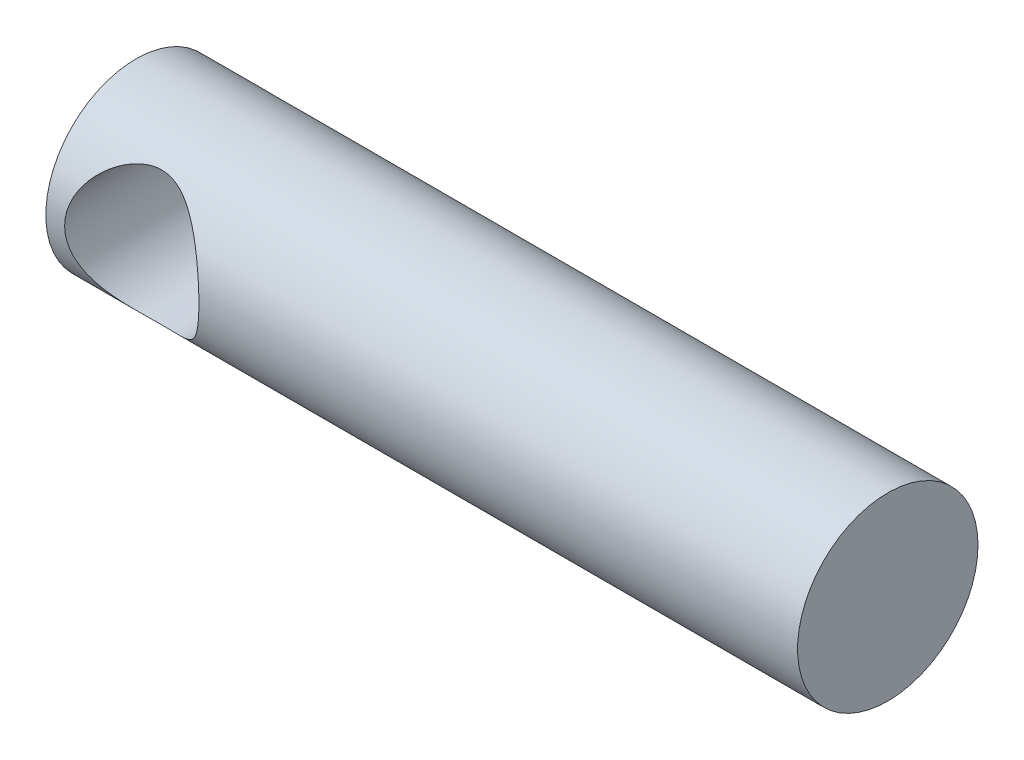
ISO-10303-21;
HEADER;
FILE_DESCRIPTION(('STEP AP214'),'2;1');
FILE_NAME('part.step','',(''),(''),'','','');
FILE_SCHEMA(('AUTOMOTIVE_DESIGN { 1 0 10303 214 1 1 1 1 }'));
ENDSEC;
DATA;
#1=APPLICATION_CONTEXT('core data for automotive mechanical design processes');
#2=APPLICATION_PROTOCOL_DEFINITION('international standard','automotive_design',2000,#1);
#3=PRODUCT_CONTEXT('',#1,'mechanical');
#4=PRODUCT('Part','Part','',(#3));
#5=PRODUCT_RELATED_PRODUCT_CATEGORY('part','',(#4));
#6=PRODUCT_DEFINITION_FORMATION('','',#4);
#7=PRODUCT_DEFINITION_CONTEXT('part definition',#1,'design');
#8=PRODUCT_DEFINITION('design','',#6,#7);
#9=PRODUCT_DEFINITION_SHAPE('','',#8);
#10=(LENGTH_UNIT() NAMED_UNIT(*) SI_UNIT(.MILLI.,.METRE.));
#11=(NAMED_UNIT(*) PLANE_ANGLE_UNIT() SI_UNIT($,.RADIAN.));
#12=(NAMED_UNIT(*) SI_UNIT($,.STERADIAN.) SOLID_ANGLE_UNIT());
#13=UNCERTAINTY_MEASURE_WITH_UNIT(LENGTH_MEASURE(1.E-05),#10,'distance_accuracy_value','');
#14=(GEOMETRIC_REPRESENTATION_CONTEXT(3) GLOBAL_UNCERTAINTY_ASSIGNED_CONTEXT((#13)) GLOBAL_UNIT_ASSIGNED_CONTEXT((#10,
#11,#12)) REPRESENTATION_CONTEXT('',''));
#15=CARTESIAN_POINT('',(0.,0.,0.));
#16=DIRECTION('',(0.,0.,1.));
#17=DIRECTION('',(1.,0.,0.));
#18=AXIS2_PLACEMENT_3D('',#15,#16,#17);
#19=CARTESIAN_POINT('',(88.9,0.,0.));
#20=DIRECTION('',(-1.,0.,0.));
#21=DIRECTION('',(0.,0.,1.));
#22=AXIS2_PLACEMENT_3D('',#19,#20,#21);
#23=CYLINDRICAL_SURFACE('',#22,10.668);
#24=CARTESIAN_POINT('',(18.0975,0.,-10.668));
#25=CARTESIAN_POINT('',(18.0974981537313,0.194173463493706,-10.6679982235985));
#26=CARTESIAN_POINT('',(18.0903612127066,0.388414681727751,-10.6626851014942));
#27=CARTESIAN_POINT('',(18.0619231269026,0.775371224910893,-10.6415515291348));
#28=CARTESIAN_POINT('',(18.0406124500999,0.968085434609475,-10.6257240078167));
#29=CARTESIAN_POINT('',(17.9841165819951,1.35077445291409,-10.5838913816648));
#30=CARTESIAN_POINT('',(17.9489017705879,1.54074250986207,-10.5578645500405));
#31=CARTESIAN_POINT('',(17.8651348478739,1.91620039976705,-10.4962191805586));
#32=CARTESIAN_POINT('',(17.8165767442088,2.10168817985684,-10.4605963333546));
#33=CARTESIAN_POINT('',(17.707191402614,2.46570283470104,-10.3808008556625));
#34=CARTESIAN_POINT('',(17.6464477470115,2.64426774285717,-10.336686548424));
#35=CARTESIAN_POINT('',(17.5132268276069,2.99485306886229,-10.240611925396));
#36=CARTESIAN_POINT('',(17.4407449239797,3.16687086546523,-10.1886485076052));
#37=CARTESIAN_POINT('',(17.2849151711086,3.50340515922758,-10.0778833564138));
#38=CARTESIAN_POINT('',(17.2015770932707,3.66792822462135,-10.01908777757));
#39=CARTESIAN_POINT('',(17.024707942592,3.98915095153025,-9.89558104965941));
#40=CARTESIAN_POINT('',(16.9311730791748,4.14584767188158,-9.83086770215852));
#41=CARTESIAN_POINT('',(16.7255890251142,4.46499899079594,-9.69036305318783));
#42=CARTESIAN_POINT('',(16.6126282743574,4.6266584229006,-9.61410026399102));
#43=CARTESIAN_POINT('',(16.3761940459171,4.93977069249647,-9.45703840106685));
#44=CARTESIAN_POINT('',(16.2527192207456,5.09122221726879,-9.37623874634635));
#45=CARTESIAN_POINT('',(15.9957185485215,5.383891027631,-9.21130812165831));
#46=CARTESIAN_POINT('',(15.8621771398846,5.52509177700157,-9.12717209335581));
#47=CARTESIAN_POINT('',(15.5857728367293,5.79676117729454,-8.95709017199413));
#48=CARTESIAN_POINT('',(15.4429125206291,5.92723277443433,-8.8711447839807));
#49=CARTESIAN_POINT('',(15.1186597825825,6.20237246208449,-8.68158980611391));
#50=CARTESIAN_POINT('',(14.9352814802537,6.34464849557614,-8.57789069003572));
#51=CARTESIAN_POINT('',(14.5559160575699,6.61315844614557,-8.37262951663241));
#52=CARTESIAN_POINT('',(14.3599252139744,6.73938759313515,-8.27106810221063));
#53=CARTESIAN_POINT('',(13.9557470607971,6.9750154199336,-8.07335131372303));
#54=CARTESIAN_POINT('',(13.7475728854203,7.08443177947339,-7.97719032923985));
#55=CARTESIAN_POINT('',(13.3192145435748,7.28555375736104,-7.79393555594933));
#56=CARTESIAN_POINT('',(13.0990372737081,7.37726941126031,-7.70683664231888));
#57=CARTESIAN_POINT('',(12.5744574148747,7.56801368117813,-7.5202698978362));
#58=CARTESIAN_POINT('',(12.2655887003992,7.6600454311593,-7.42571680681089));
#59=CARTESIAN_POINT('',(11.78992428133,7.7700552902102,-7.30994497374178));
#60=CARTESIAN_POINT('',(11.6294008562399,7.80204239080579,-7.2757090001379));
#61=CARTESIAN_POINT('',(11.3049502809891,7.85620761274224,-7.21718935894717));
#62=CARTESIAN_POINT('',(11.1410249130206,7.87839074078421,-7.19290061196803));
#63=CARTESIAN_POINT('',(10.8093613711391,7.91266583613859,-7.15518038777917));
#64=CARTESIAN_POINT('',(10.6416021673676,7.92466527655269,-7.14184849607725));
#65=CARTESIAN_POINT('',(10.3051312707832,7.93795840926517,-7.12707107895046));
#66=CARTESIAN_POINT('',(10.1364196001722,7.93925235008534,-7.1256252775971));
#67=CARTESIAN_POINT('',(9.79952074565226,7.93110124360336,-7.13469634603869));
#68=CARTESIAN_POINT('',(9.63133378674987,7.92165209326755,-7.14521778639921));
#69=CARTESIAN_POINT('',(9.29701227412989,7.892231816579,-7.17769992312988));
#70=CARTESIAN_POINT('',(9.13087774536364,7.87226056243785,-7.19966075842869));
#71=CARTESIAN_POINT('',(8.81868189848887,7.82477494312497,-7.2512211966267));
#72=CARTESIAN_POINT('',(8.67230173217317,7.79823788704293,-7.2798130282152));
#73=CARTESIAN_POINT('',(8.3828140833022,7.73740359552193,-7.3444387383459));
#74=CARTESIAN_POINT('',(8.23970779160708,7.70310358424274,-7.38047527852829));
#75=CARTESIAN_POINT('',(7.81593020937245,7.58912297863978,-7.49822299947701));
#76=CARTESIAN_POINT('',(7.54081968592588,7.49836485472228,-7.58956882201684));
#77=CARTESIAN_POINT('',(7.0589923502679,7.31034980918724,-7.77036706404471));
#78=CARTESIAN_POINT('',(6.84927583338747,7.21767548537095,-7.85682437352278));
#79=CARTESIAN_POINT('',(6.44108891613317,7.0160820375471,-8.03735829777264));
#80=CARTESIAN_POINT('',(6.24262420815142,6.90715479047407,-8.13143871169807));
#81=CARTESIAN_POINT('',(5.85684830095659,6.67366083511031,-8.32414827492528));
#82=CARTESIAN_POINT('',(5.66956079945586,6.54906252499665,-8.42278635340385));
#83=CARTESIAN_POINT('',(5.30678527351973,6.28494527838099,-8.62165965430591));
#84=CARTESIAN_POINT('',(5.13129544721904,6.14542862883571,-8.72189462992853));
#85=CARTESIAN_POINT('',(4.78852781285286,5.84840211081006,-8.92386795890091));
#86=CARTESIAN_POINT('',(4.62153529232953,5.6905496726704,-9.02558717986399));
#87=CARTESIAN_POINT('',(4.30092129017948,5.35986339858099,-9.22580364267782));
#88=CARTESIAN_POINT('',(4.14730115768513,5.18702805451741,-9.32430055880787));
#89=CARTESIAN_POINT('',(3.854665206737,4.82704566807623,-9.51563637284307));
#90=CARTESIAN_POINT('',(3.71562475607485,4.6399237184641,-9.60848469877309));
#91=CARTESIAN_POINT('',(3.4531111844245,4.25163849827389,-9.78648932442247));
#92=CARTESIAN_POINT('',(3.32963395793675,4.05047895258819,-9.87164765103682));
#93=CARTESIAN_POINT('',(3.12327763266621,3.67751221652342,-10.015662934679));
#94=CARTESIAN_POINT('',(3.03726361699985,3.50813393213918,-10.0763341235635));
#95=CARTESIAN_POINT('',(2.87683300942337,3.16161666269953,-10.1903706655665));
#96=CARTESIAN_POINT('',(2.80241402738157,2.98447928672783,-10.2437375240801));
#97=CARTESIAN_POINT('',(2.66603666068609,2.62329282408181,-10.3421262656486));
#98=CARTESIAN_POINT('',(2.60407338025209,2.43924648690145,-10.387151426905));
#99=CARTESIAN_POINT('',(2.49339375734936,2.06520889117994,-10.4679385452534));
#100=CARTESIAN_POINT('',(2.4446775989057,1.87521755009343,-10.5037003736617));
#101=CARTESIAN_POINT('',(2.36098071676318,1.48942632581983,-10.5653306638103));
#102=CARTESIAN_POINT('',(2.32608358364784,1.29359857328151,-10.5911388929907));
#103=CARTESIAN_POINT('',(2.27102843315592,0.898755975574256,-10.6319258605307));
#104=CARTESIAN_POINT('',(2.25087044524115,0.699741124035486,-10.6469045772435));
#105=CARTESIAN_POINT('',(2.22565859821612,0.30028540619302,-10.6656467237715));
#106=CARTESIAN_POINT('',(2.22060038439874,0.099844967740994,-10.6694133870917));
#107=CARTESIAN_POINT('',(2.22567065376307,-0.30072763759065,-10.6656409168942));
#108=CARTESIAN_POINT('',(2.23579803918039,-0.500859825706729,-10.6581026006116));
#109=CARTESIAN_POINT('',(2.26934814054771,-0.879861427063346,-10.6331836513277));
#110=CARTESIAN_POINT('',(2.2913964818993,-1.05892235010454,-10.6168208273942));
#111=CARTESIAN_POINT('',(2.34742726083676,-1.41420041090409,-10.575360745326));
#112=CARTESIAN_POINT('',(2.38141368843658,-1.59041657725038,-10.5502605669691));
#113=CARTESIAN_POINT('',(2.46085148164392,-1.93879715076911,-10.4918293117964));
#114=CARTESIAN_POINT('',(2.50630015461079,-2.1109624991646,-10.4585001681173));
#115=CARTESIAN_POINT('',(2.60812333673557,-2.45040440671212,-10.3842162566073));
#116=CARTESIAN_POINT('',(2.66450211680494,-2.61767902532465,-10.343258508165));
#117=CARTESIAN_POINT('',(2.79002117543767,-2.95307278936013,-10.2526552992554));
#118=CARTESIAN_POINT('',(2.85958125833584,-3.12095875880343,-10.2027281575336));
#119=CARTESIAN_POINT('',(3.00912351378917,-3.44986244278332,-10.0962670090295));
#120=CARTESIAN_POINT('',(3.08910923666097,-3.61087779271267,-10.0397307522783));
#121=CARTESIAN_POINT('',(3.34363854788963,-4.08273022733039,-9.86155746785102));
#122=CARTESIAN_POINT('',(3.53285079252503,-4.38262788872672,-9.7312851420456));
#123=CARTESIAN_POINT('',(3.85927567717184,-4.83185818911219,-9.51280666176282));
#124=CARTESIAN_POINT('',(3.98543698925405,-4.9919841414018,-9.42960692290121));
#125=CARTESIAN_POINT('',(4.24858542875488,-5.30096348788405,-9.25943064234908));
#126=CARTESIAN_POINT('',(4.38557124012302,-5.44981824814026,-9.17245456036663));
#127=CARTESIAN_POINT('',(4.67009084908692,-5.7363480651617,-8.99605059190256));
#128=CARTESIAN_POINT('',(4.81764999380066,-5.87399444375213,-8.90661715361319));
#129=CARTESIAN_POINT('',(5.12254075243856,-6.13746611941889,-8.72714906760182));
#130=CARTESIAN_POINT('',(5.27986993520365,-6.26329433788047,-8.63711457438267));
#131=CARTESIAN_POINT('',(5.63394424524593,-6.52500806081898,-8.44167257622824));
#132=CARTESIAN_POINT('',(5.83261050121434,-6.6584745301233,-8.33648931894272));
#133=CARTESIAN_POINT('',(6.2431360466752,-6.90795130823711,-8.13096300419053));
#134=CARTESIAN_POINT('',(6.45500015754005,-7.02395518420008,-8.03062173961388));
#135=CARTESIAN_POINT('',(6.89110215049492,-7.23719401080273,-7.83898820545805));
#136=CARTESIAN_POINT('',(7.1153049234461,-7.33447900047455,-7.74767213727127));
#137=CARTESIAN_POINT('',(7.57611202006222,-7.50919567769317,-7.578456467941));
#138=CARTESIAN_POINT('',(7.8127053726462,-7.58664458249364,-7.50054525111758));
#139=CARTESIAN_POINT('',(8.20254237457723,-7.69387643515624,-7.39012151023489));
#140=CARTESIAN_POINT('',(8.35228483764532,-7.73046639000611,-7.35175709369805));
#141=CARTESIAN_POINT('',(8.65540640781927,-7.7951329777386,-7.28315528317866));
#142=CARTESIAN_POINT('',(8.80878421988865,-7.82321259457512,-7.25291504106498));
#143=CARTESIAN_POINT('',(9.11817801970769,-7.87038467826714,-7.20170016030377));
#144=CARTESIAN_POINT('',(9.27418893142051,-7.88949275726755,-7.18070942972983));
#145=CARTESIAN_POINT('',(9.58810594111548,-7.9184394529045,-7.14877678758979));
#146=CARTESIAN_POINT('',(9.74601205536106,-7.92827798993801,-7.13783496231958));
#147=CARTESIAN_POINT('',(10.0631452440391,-7.93850067228854,-7.12646421092528));
#148=CARTESIAN_POINT('',(10.2223750750736,-7.938846960985,-7.12607737985207));
#149=CARTESIAN_POINT('',(10.5402295326555,-7.92998179734401,-7.1359410559813));
#150=CARTESIAN_POINT('',(10.6988541685252,-7.92077049283006,-7.14619139866278));
#151=CARTESIAN_POINT('',(11.014429551865,-7.89296990924221,-7.17688475444333));
#152=CARTESIAN_POINT('',(11.1713785061832,-7.87437144672176,-7.19733774855605));
#153=CARTESIAN_POINT('',(11.4824893235576,-7.82813427612752,-7.24759942803356));
#154=CARTESIAN_POINT('',(11.6366494578551,-7.80049015059481,-7.27741371945731));
#155=CARTESIAN_POINT('',(11.9792576587919,-7.72864762588271,-7.35374858346031));
#156=CARTESIAN_POINT('',(12.1666869307586,-7.68204128054512,-7.40258043443077));
#157=CARTESIAN_POINT('',(12.5348823920263,-7.5763162752128,-7.51074986767658));
#158=CARTESIAN_POINT('',(12.7156456924188,-7.51719226341254,-7.57009194171526));
#159=CARTESIAN_POINT('',(13.0702822046127,-7.38714460102178,-7.6970505099603));
#160=CARTESIAN_POINT('',(13.2441412486884,-7.31619809787694,-7.76468296096582));
#161=CARTESIAN_POINT('',(13.5843566323208,-7.16327289846682,-7.90598440422736));
#162=CARTESIAN_POINT('',(13.750712618186,-7.08129368284744,-7.97965368059711));
#163=CARTESIAN_POINT('',(14.1276539235624,-6.87901369221273,-8.15527910499137));
#164=CARTESIAN_POINT('',(14.3354456306238,-6.75482481175776,-8.2587698955562));
#165=CARTESIAN_POINT('',(14.7376866141235,-6.48897754694807,-8.46924837061298));
#166=CARTESIAN_POINT('',(14.9321320970766,-6.34731422746038,-8.57623703667646));
#167=CARTESIAN_POINT('',(15.3074196558744,-6.04696340501948,-8.7905927830085));
#168=CARTESIAN_POINT('',(15.4882531338598,-5.88826529322957,-8.8979600583427));
#169=CARTESIAN_POINT('',(15.8355222516085,-5.55431100185829,-9.11015876993223));
#170=CARTESIAN_POINT('',(16.001959532644,-5.37905671458143,-9.21499049427474));
#171=CARTESIAN_POINT('',(16.3203656880936,-5.01131459782465,-9.42005931374912));
#172=CARTESIAN_POINT('',(16.472249124743,-4.81873650975164,-9.52026767557796));
#173=CARTESIAN_POINT('',(16.7591608263161,-4.41766528272784,-9.7128750194587));
#174=CARTESIAN_POINT('',(16.8941869452104,-4.2091701228796,-9.80527300672437));
#175=CARTESIAN_POINT('',(17.1454413641743,-3.77753284581939,-9.979505787637));
#176=CARTESIAN_POINT('',(17.2617047637974,-3.55441920170487,-10.0613602458266));
#177=CARTESIAN_POINT('',(17.473790497815,-3.09457481566068,-10.2121637360015));
#178=CARTESIAN_POINT('',(17.5696236942051,-2.85785139498526,-10.2811196232852));
#179=CARTESIAN_POINT('',(17.7139424862377,-2.44431988138111,-10.3856962249873));
#180=CARTESIAN_POINT('',(17.7680575892754,-2.27042155871291,-10.4251514076085));
#181=CARTESIAN_POINT('',(17.8645127785224,-1.91775390841327,-10.495749200895));
#182=CARTESIAN_POINT('',(17.9068557335624,-1.73898577921668,-10.5268938367368));
#183=CARTESIAN_POINT('',(17.9791119773052,-1.37810812229034,-10.5801813222711));
#184=CARTESIAN_POINT('',(18.0090558529717,-1.19600798827397,-10.6023463206375));
#185=CARTESIAN_POINT('',(18.0562155275319,-0.829344867227843,-10.6373062624126));
#186=CARTESIAN_POINT('',(18.0734386404014,-0.644783357646822,-10.6501065901258));
#187=CARTESIAN_POINT('',(18.0886150511475,-0.38320857974317,-10.6613905486436));
#188=CARTESIAN_POINT('',(18.0919453966954,-0.306633644852597,-10.663867646816));
#189=CARTESIAN_POINT('',(18.0963883571447,-0.153376003891987,-10.6671728135859));
#190=CARTESIAN_POINT('',(18.0975007292264,-0.0766932869416856,-10.6680007016307));
#191=CARTESIAN_POINT('',(18.0975,0.,-10.668));
#192=B_SPLINE_CURVE_WITH_KNOTS('',3,(#24,#25,#26,#27,#28,#29,#30,#31,#32,#33,#34,#35,#36,#37,
#38,#39,#40,#41,#42,#43,#44,#45,#46,#47,#48,#49,#50,#51,#52,#53,#54,#55,#56,#57,#58,#59,#60,#61,
#62,#63,#64,#65,#66,#67,#68,#69,#70,#71,#72,#73,#74,#75,#76,#77,#78,#79,#80,#81,#82,#83,#84,#85,
#86,#87,#88,#89,#90,#91,#92,#93,#94,#95,#96,#97,#98,#99,#100,#101,#102,#103,#104,#105,#106,#107,
#108,#109,#110,#111,#112,#113,#114,#115,#116,#117,#118,#119,#120,#121,#122,#123,#124,#125,#126,
#127,#128,#129,#130,#131,#132,#133,#134,#135,#136,#137,#138,#139,#140,#141,#142,#143,#144,#145,
#146,#147,#148,#149,#150,#151,#152,#153,#154,#155,#156,#157,#158,#159,#160,#161,#162,#163,#164,
#165,#166,#167,#168,#169,#170,#171,#172,#173,#174,#175,#176,#177,#178,#179,#180,#181,#182,#183,
#184,#185,#186,#187,#188,#189,#190,#191),.UNSPECIFIED.,.T.,.F.,(4,2,2,2,2,2,2,2,2,2,2,2,2,2,2,2,
2,2,2,2,2,2,2,2,2,2,2,2,2,2,2,2,2,2,2,2,2,2,2,2,2,2,2,2,2,2,2,2,2,2,2,2,2,2,2,2,2,2,2,2,2,2,2,2,
2,2,2,2,2,2,2,2,2,2,2,2,2,2,2,2,2,2,2,4),(0.,0.582436018606607,1.16526412967916,
1.74934060241072,2.33367980878534,2.91414016263382,3.49483051995196,4.07500177597262,
4.65538944640144,5.28913781092165,5.92296751947771,6.55779797121388,7.19245351277453,
7.9542486021239,8.71626961534292,9.4774837481552,10.2382650286876,11.2416853737741,
11.7428450174178,12.2437484318575,12.7491556613623,13.2545511581064,13.7601397418771,
14.2657344660408,14.7197528343092,15.1739338054999,16.0823552423897,16.816598900086,
17.5512107630644,18.2873285172225,19.0233335870918,19.7764280608582,20.529598426036,
21.2814750900965,22.0331529959371,22.6308444010609,23.2284124381448,23.8257451366574,
24.4230861327147,25.0239871524518,25.6248893733162,26.2256182799249,26.8263037620365,
27.3691386604681,27.9121551611177,28.4550442182726,28.9981458370617,29.562941941348,
30.127930884594,31.2570736556978,31.9171486657524,32.5771435465231,33.2387772631581,
33.9002469946772,34.6836010111228,35.4672428959818,36.2487599367966,37.0295963226467,
37.5057389915698,37.9817145183828,38.4568586608927,38.9320068837082,39.4090497999022,
39.8860853379721,40.3635884665837,40.8413780974456,41.4381194322656,42.0351164150649,
42.6332810550969,43.2314738629973,44.0202407707996,44.8092309544699,45.5987153837716,
46.3881096870886,47.1818856814869,47.9757626251226,48.7681367969699,49.5600886358433,
50.118574294593,50.6769237328286,51.233887467563,51.7905307186003,52.020552073859,
52.2505986100667),.UNSPECIFIED.);
#193=CARTESIAN_POINT('',(18.0975,0.,-10.668));
#194=VERTEX_POINT('',#193);
#195=EDGE_CURVE('E10',#194,#194,#192,.T.);
#196=ORIENTED_EDGE('',*,*,#195,.T.);
#197=EDGE_LOOP('',(#196));
#198=FACE_BOUND('',#197,.T.);
#199=CARTESIAN_POINT('',(18.0975,0.,10.668));
#200=CARTESIAN_POINT('',(18.0974981537313,-0.194173463493706,10.6679982235985));
#201=CARTESIAN_POINT('',(18.0903612127066,-0.388414681727751,10.6626851014942));
#202=CARTESIAN_POINT('',(18.0619231269026,-0.775371224910893,10.6415515291348));
#203=CARTESIAN_POINT('',(18.0406124500999,-0.968085434609475,10.6257240078167));
#204=CARTESIAN_POINT('',(17.9841165819951,-1.35077445291409,10.5838913816648));
#205=CARTESIAN_POINT('',(17.9489017705879,-1.54074250986207,10.5578645500405));
#206=CARTESIAN_POINT('',(17.8651348478739,-1.91620039976705,10.4962191805586));
#207=CARTESIAN_POINT('',(17.8165767442088,-2.10168817985684,10.4605963333546));
#208=CARTESIAN_POINT('',(17.707191402614,-2.46570283470104,10.3808008556625));
#209=CARTESIAN_POINT('',(17.6464477470115,-2.64426774285717,10.336686548424));
#210=CARTESIAN_POINT('',(17.5132268276069,-2.99485306886229,10.240611925396));
#211=CARTESIAN_POINT('',(17.4407449239797,-3.16687086546523,10.1886485076052));
#212=CARTESIAN_POINT('',(17.2849151711086,-3.50340515922758,10.0778833564138));
#213=CARTESIAN_POINT('',(17.2015770932707,-3.66792822462135,10.01908777757));
#214=CARTESIAN_POINT('',(17.024707942592,-3.98915095153025,9.89558104965941));
#215=CARTESIAN_POINT('',(16.9311730791748,-4.14584767188158,9.83086770215852));
#216=CARTESIAN_POINT('',(16.7255890251142,-4.46499899079594,9.69036305318783));
#217=CARTESIAN_POINT('',(16.6126282743574,-4.6266584229006,9.61410026399102));
#218=CARTESIAN_POINT('',(16.3761940459171,-4.93977069249647,9.45703840106685));
#219=CARTESIAN_POINT('',(16.2527192207456,-5.09122221726879,9.37623874634635));
#220=CARTESIAN_POINT('',(15.9957185485215,-5.383891027631,9.21130812165831));
#221=CARTESIAN_POINT('',(15.8621771398846,-5.52509177700157,9.12717209335581));
#222=CARTESIAN_POINT('',(15.5857728367293,-5.79676117729454,8.95709017199413));
#223=CARTESIAN_POINT('',(15.4429125206291,-5.92723277443433,8.8711447839807));
#224=CARTESIAN_POINT('',(15.1186597825825,-6.20237246208449,8.68158980611391));
#225=CARTESIAN_POINT('',(14.9352814802537,-6.34464849557614,8.57789069003572));
#226=CARTESIAN_POINT('',(14.5559160575699,-6.61315844614557,8.37262951663241));
#227=CARTESIAN_POINT('',(14.3599252139744,-6.73938759313515,8.27106810221063));
#228=CARTESIAN_POINT('',(13.9557470607971,-6.9750154199336,8.07335131372303));
#229=CARTESIAN_POINT('',(13.7475728854203,-7.08443177947339,7.97719032923985));
#230=CARTESIAN_POINT('',(13.3192145435748,-7.28555375736104,7.79393555594933));
#231=CARTESIAN_POINT('',(13.0990372737081,-7.37726941126031,7.70683664231888));
#232=CARTESIAN_POINT('',(12.5744574148747,-7.56801368117813,7.5202698978362));
#233=CARTESIAN_POINT('',(12.2655887003992,-7.6600454311593,7.42571680681089));
#234=CARTESIAN_POINT('',(11.78992428133,-7.7700552902102,7.30994497374178));
#235=CARTESIAN_POINT('',(11.6294008562399,-7.80204239080579,7.2757090001379));
#236=CARTESIAN_POINT('',(11.3049502809891,-7.85620761274224,7.21718935894717));
#237=CARTESIAN_POINT('',(11.1410249130206,-7.87839074078421,7.19290061196803));
#238=CARTESIAN_POINT('',(10.8093613711391,-7.91266583613859,7.15518038777917));
#239=CARTESIAN_POINT('',(10.6416021673676,-7.92466527655269,7.14184849607725));
#240=CARTESIAN_POINT('',(10.3051312707832,-7.93795840926517,7.12707107895046));
#241=CARTESIAN_POINT('',(10.1364196001722,-7.93925235008534,7.1256252775971));
#242=CARTESIAN_POINT('',(9.79952074565226,-7.93110124360336,7.13469634603869));
#243=CARTESIAN_POINT('',(9.63133378674987,-7.92165209326755,7.14521778639921));
#244=CARTESIAN_POINT('',(9.29701227412989,-7.892231816579,7.17769992312988));
#245=CARTESIAN_POINT('',(9.13087774536364,-7.87226056243785,7.19966075842869));
#246=CARTESIAN_POINT('',(8.81868189848887,-7.82477494312497,7.2512211966267));
#247=CARTESIAN_POINT('',(8.67230173217317,-7.79823788704293,7.2798130282152));
#248=CARTESIAN_POINT('',(8.3828140833022,-7.73740359552193,7.3444387383459));
#249=CARTESIAN_POINT('',(8.23970779160708,-7.70310358424274,7.38047527852829));
#250=CARTESIAN_POINT('',(7.81593020937245,-7.58912297863978,7.49822299947701));
#251=CARTESIAN_POINT('',(7.54081968592588,-7.49836485472228,7.58956882201684));
#252=CARTESIAN_POINT('',(7.0589923502679,-7.31034980918724,7.77036706404471));
#253=CARTESIAN_POINT('',(6.84927583338747,-7.21767548537095,7.85682437352278));
#254=CARTESIAN_POINT('',(6.44108891613317,-7.0160820375471,8.03735829777264));
#255=CARTESIAN_POINT('',(6.24262420815142,-6.90715479047407,8.13143871169807));
#256=CARTESIAN_POINT('',(5.85684830095659,-6.67366083511031,8.32414827492528));
#257=CARTESIAN_POINT('',(5.66956079945586,-6.54906252499665,8.42278635340385));
#258=CARTESIAN_POINT('',(5.30678527351973,-6.28494527838099,8.62165965430591));
#259=CARTESIAN_POINT('',(5.13129544721904,-6.14542862883571,8.72189462992853));
#260=CARTESIAN_POINT('',(4.78852781285286,-5.84840211081006,8.92386795890091));
#261=CARTESIAN_POINT('',(4.62153529232953,-5.6905496726704,9.02558717986399));
#262=CARTESIAN_POINT('',(4.30092129017948,-5.35986339858099,9.22580364267782));
#263=CARTESIAN_POINT('',(4.14730115768513,-5.18702805451741,9.32430055880787));
#264=CARTESIAN_POINT('',(3.854665206737,-4.82704566807623,9.51563637284307));
#265=CARTESIAN_POINT('',(3.71562475607485,-4.6399237184641,9.60848469877309));
#266=CARTESIAN_POINT('',(3.4531111844245,-4.25163849827389,9.78648932442247));
#267=CARTESIAN_POINT('',(3.32963395793675,-4.05047895258819,9.87164765103682));
#268=CARTESIAN_POINT('',(3.12327763266621,-3.67751221652342,10.015662934679));
#269=CARTESIAN_POINT('',(3.03726361699985,-3.50813393213918,10.0763341235635));
#270=CARTESIAN_POINT('',(2.87683300942337,-3.16161666269953,10.1903706655665));
#271=CARTESIAN_POINT('',(2.80241402738157,-2.98447928672783,10.2437375240801));
#272=CARTESIAN_POINT('',(2.66603666068609,-2.62329282408181,10.3421262656486));
#273=CARTESIAN_POINT('',(2.60407338025209,-2.43924648690145,10.387151426905));
#274=CARTESIAN_POINT('',(2.49339375734936,-2.06520889117994,10.4679385452534));
#275=CARTESIAN_POINT('',(2.4446775989057,-1.87521755009343,10.5037003736617));
#276=CARTESIAN_POINT('',(2.36098071676318,-1.48942632581983,10.5653306638103));
#277=CARTESIAN_POINT('',(2.32608358364784,-1.29359857328151,10.5911388929907));
#278=CARTESIAN_POINT('',(2.27102843315592,-0.898755975574256,10.6319258605307));
#279=CARTESIAN_POINT('',(2.25087044524115,-0.699741124035486,10.6469045772435));
#280=CARTESIAN_POINT('',(2.22565859821612,-0.30028540619302,10.6656467237715));
#281=CARTESIAN_POINT('',(2.22060038439874,-0.099844967740994,10.6694133870917));
#282=CARTESIAN_POINT('',(2.22567065376307,0.30072763759065,10.6656409168942));
#283=CARTESIAN_POINT('',(2.23579803918039,0.500859825706729,10.6581026006116));
#284=CARTESIAN_POINT('',(2.26934814054771,0.879861427063346,10.6331836513277));
#285=CARTESIAN_POINT('',(2.2913964818993,1.05892235010454,10.6168208273942));
#286=CARTESIAN_POINT('',(2.34742726083676,1.41420041090409,10.575360745326));
#287=CARTESIAN_POINT('',(2.38141368843658,1.59041657725038,10.5502605669691));
#288=CARTESIAN_POINT('',(2.46085148164392,1.93879715076911,10.4918293117964));
#289=CARTESIAN_POINT('',(2.50630015461079,2.1109624991646,10.4585001681173));
#290=CARTESIAN_POINT('',(2.60812333673557,2.45040440671212,10.3842162566073));
#291=CARTESIAN_POINT('',(2.66450211680494,2.61767902532465,10.343258508165));
#292=CARTESIAN_POINT('',(2.79002117543767,2.95307278936013,10.2526552992554));
#293=CARTESIAN_POINT('',(2.85958125833584,3.12095875880343,10.2027281575336));
#294=CARTESIAN_POINT('',(3.00912351378917,3.44986244278332,10.0962670090295));
#295=CARTESIAN_POINT('',(3.08910923666097,3.61087779271267,10.0397307522783));
#296=CARTESIAN_POINT('',(3.34363854788963,4.08273022733039,9.86155746785102));
#297=CARTESIAN_POINT('',(3.53285079252503,4.38262788872672,9.7312851420456));
#298=CARTESIAN_POINT('',(3.85927567717184,4.83185818911219,9.51280666176282));
#299=CARTESIAN_POINT('',(3.98543698925405,4.9919841414018,9.42960692290121));
#300=CARTESIAN_POINT('',(4.24858542875488,5.30096348788405,9.25943064234908));
#301=CARTESIAN_POINT('',(4.38557124012302,5.44981824814026,9.17245456036663));
#302=CARTESIAN_POINT('',(4.67009084908692,5.7363480651617,8.99605059190256));
#303=CARTESIAN_POINT('',(4.81764999380066,5.87399444375213,8.90661715361319));
#304=CARTESIAN_POINT('',(5.12254075243856,6.13746611941889,8.72714906760182));
#305=CARTESIAN_POINT('',(5.27986993520365,6.26329433788047,8.63711457438267));
#306=CARTESIAN_POINT('',(5.63394424524593,6.52500806081898,8.44167257622824));
#307=CARTESIAN_POINT('',(5.83261050121434,6.6584745301233,8.33648931894272));
#308=CARTESIAN_POINT('',(6.2431360466752,6.90795130823711,8.13096300419053));
#309=CARTESIAN_POINT('',(6.45500015754005,7.02395518420008,8.03062173961388));
#310=CARTESIAN_POINT('',(6.89110215049492,7.23719401080273,7.83898820545805));
#311=CARTESIAN_POINT('',(7.1153049234461,7.33447900047455,7.74767213727127));
#312=CARTESIAN_POINT('',(7.57611202006222,7.50919567769317,7.578456467941));
#313=CARTESIAN_POINT('',(7.8127053726462,7.58664458249364,7.50054525111758));
#314=CARTESIAN_POINT('',(8.20254237457723,7.69387643515624,7.39012151023489));
#315=CARTESIAN_POINT('',(8.35228483764532,7.73046639000611,7.35175709369805));
#316=CARTESIAN_POINT('',(8.65540640781927,7.7951329777386,7.28315528317866));
#317=CARTESIAN_POINT('',(8.80878421988865,7.82321259457512,7.25291504106498));
#318=CARTESIAN_POINT('',(9.11817801970769,7.87038467826714,7.20170016030377));
#319=CARTESIAN_POINT('',(9.27418893142051,7.88949275726755,7.18070942972983));
#320=CARTESIAN_POINT('',(9.58810594111548,7.9184394529045,7.14877678758979));
#321=CARTESIAN_POINT('',(9.74601205536106,7.92827798993801,7.13783496231958));
#322=CARTESIAN_POINT('',(10.0631452440391,7.93850067228854,7.12646421092528));
#323=CARTESIAN_POINT('',(10.2223750750736,7.938846960985,7.12607737985207));
#324=CARTESIAN_POINT('',(10.5402295326555,7.92998179734401,7.1359410559813));
#325=CARTESIAN_POINT('',(10.6988541685252,7.92077049283006,7.14619139866278));
#326=CARTESIAN_POINT('',(11.014429551865,7.89296990924221,7.17688475444333));
#327=CARTESIAN_POINT('',(11.1713785061832,7.87437144672176,7.19733774855605));
#328=CARTESIAN_POINT('',(11.4824893235576,7.82813427612752,7.24759942803356));
#329=CARTESIAN_POINT('',(11.6366494578551,7.80049015059481,7.27741371945731));
#330=CARTESIAN_POINT('',(11.9792576587919,7.72864762588271,7.35374858346031));
#331=CARTESIAN_POINT('',(12.1666869307586,7.68204128054512,7.40258043443077));
#332=CARTESIAN_POINT('',(12.5348823920263,7.5763162752128,7.51074986767658));
#333=CARTESIAN_POINT('',(12.7156456924188,7.51719226341254,7.57009194171526));
#334=CARTESIAN_POINT('',(13.0702822046127,7.38714460102178,7.6970505099603));
#335=CARTESIAN_POINT('',(13.2441412486884,7.31619809787694,7.76468296096582));
#336=CARTESIAN_POINT('',(13.5843566323208,7.16327289846682,7.90598440422736));
#337=CARTESIAN_POINT('',(13.750712618186,7.08129368284744,7.97965368059711));
#338=CARTESIAN_POINT('',(14.1276539235624,6.87901369221273,8.15527910499137));
#339=CARTESIAN_POINT('',(14.3354456306238,6.75482481175776,8.2587698955562));
#340=CARTESIAN_POINT('',(14.7376866141235,6.48897754694807,8.46924837061298));
#341=CARTESIAN_POINT('',(14.9321320970766,6.34731422746038,8.57623703667646));
#342=CARTESIAN_POINT('',(15.3074196558744,6.04696340501948,8.7905927830085));
#343=CARTESIAN_POINT('',(15.4882531338598,5.88826529322957,8.8979600583427));
#344=CARTESIAN_POINT('',(15.8355222516085,5.55431100185829,9.11015876993223));
#345=CARTESIAN_POINT('',(16.001959532644,5.37905671458143,9.21499049427474));
#346=CARTESIAN_POINT('',(16.3203656880936,5.01131459782465,9.42005931374912));
#347=CARTESIAN_POINT('',(16.472249124743,4.81873650975164,9.52026767557796));
#348=CARTESIAN_POINT('',(16.7591608263161,4.41766528272784,9.7128750194587));
#349=CARTESIAN_POINT('',(16.8941869452104,4.2091701228796,9.80527300672437));
#350=CARTESIAN_POINT('',(17.1454413641743,3.77753284581939,9.979505787637));
#351=CARTESIAN_POINT('',(17.2617047637974,3.55441920170487,10.0613602458266));
#352=CARTESIAN_POINT('',(17.473790497815,3.09457481566068,10.2121637360015));
#353=CARTESIAN_POINT('',(17.5696236942051,2.85785139498526,10.2811196232852));
#354=CARTESIAN_POINT('',(17.7139424862377,2.44431988138111,10.3856962249873));
#355=CARTESIAN_POINT('',(17.7680575892754,2.27042155871291,10.4251514076085));
#356=CARTESIAN_POINT('',(17.8645127785224,1.91775390841327,10.495749200895));
#357=CARTESIAN_POINT('',(17.9068557335624,1.73898577921668,10.5268938367368));
#358=CARTESIAN_POINT('',(17.9791119773052,1.37810812229034,10.5801813222711));
#359=CARTESIAN_POINT('',(18.0090558529717,1.19600798827397,10.6023463206375));
#360=CARTESIAN_POINT('',(18.0562155275319,0.829344867227843,10.6373062624126));
#361=CARTESIAN_POINT('',(18.0734386404014,0.644783357646822,10.6501065901258));
#362=CARTESIAN_POINT('',(18.0886150511475,0.38320857974317,10.6613905486436));
#363=CARTESIAN_POINT('',(18.0919453966954,0.306633644852597,10.663867646816));
#364=CARTESIAN_POINT('',(18.0963883571447,0.153376003891987,10.6671728135859));
#365=CARTESIAN_POINT('',(18.0975007292264,0.0766932869416856,10.6680007016307));
#366=CARTESIAN_POINT('',(18.0975,0.,10.668));
#367=B_SPLINE_CURVE_WITH_KNOTS('',3,(#199,#200,#201,#202,#203,#204,#205,#206,#207,#208,#209,
#210,#211,#212,#213,#214,#215,#216,#217,#218,#219,#220,#221,#222,#223,#224,#225,#226,#227,#228,
#229,#230,#231,#232,#233,#234,#235,#236,#237,#238,#239,#240,#241,#242,#243,#244,#245,#246,#247,
#248,#249,#250,#251,#252,#253,#254,#255,#256,#257,#258,#259,#260,#261,#262,#263,#264,#265,#266,
#267,#268,#269,#270,#271,#272,#273,#274,#275,#276,#277,#278,#279,#280,#281,#282,#283,#284,#285,
#286,#287,#288,#289,#290,#291,#292,#293,#294,#295,#296,#297,#298,#299,#300,#301,#302,#303,#304,
#305,#306,#307,#308,#309,#310,#311,#312,#313,#314,#315,#316,#317,#318,#319,#320,#321,#322,#323,
#324,#325,#326,#327,#328,#329,#330,#331,#332,#333,#334,#335,#336,#337,#338,#339,#340,#341,#342,
#343,#344,#345,#346,#347,#348,#349,#350,#351,#352,#353,#354,#355,#356,#357,#358,#359,#360,#361,
#362,#363,#364,#365,#366),.UNSPECIFIED.,.T.,.F.,(4,2,2,2,2,2,2,2,2,2,2,2,2,2,2,2,2,2,2,2,2,2,2,
2,2,2,2,2,2,2,2,2,2,2,2,2,2,2,2,2,2,2,2,2,2,2,2,2,2,2,2,2,2,2,2,2,2,2,2,2,2,2,2,2,2,2,2,2,2,2,2,
2,2,2,2,2,2,2,2,2,2,2,2,4),(0.,0.582436018606607,1.16526412967916,1.74934060241072,
2.33367980878534,2.91414016263382,3.49483051995196,4.07500177597262,4.65538944640144,
5.28913781092165,5.92296751947771,6.55779797121388,7.19245351277453,7.9542486021239,
8.71626961534292,9.4774837481552,10.2382650286876,11.2416853737741,11.7428450174178,
12.2437484318575,12.7491556613623,13.2545511581064,13.7601397418771,14.2657344660408,
14.7197528343092,15.1739338054999,16.0823552423897,16.816598900086,17.5512107630644,
18.2873285172225,19.0233335870918,19.7764280608582,20.529598426036,21.2814750900965,
22.0331529959371,22.6308444010609,23.2284124381448,23.8257451366574,24.4230861327147,
25.0239871524518,25.6248893733162,26.2256182799249,26.8263037620365,27.3691386604681,
27.9121551611177,28.4550442182726,28.9981458370617,29.562941941348,30.127930884594,
31.2570736556978,31.9171486657524,32.5771435465231,33.2387772631581,33.9002469946772,
34.6836010111228,35.4672428959818,36.2487599367966,37.0295963226467,37.5057389915698,
37.9817145183828,38.4568586608927,38.9320068837082,39.4090497999022,39.8860853379721,
40.3635884665837,40.8413780974456,41.4381194322656,42.0351164150649,42.6332810550969,
43.2314738629973,44.0202407707996,44.8092309544699,45.5987153837716,46.3881096870886,
47.1818856814869,47.9757626251226,48.7681367969699,49.5600886358433,50.118574294593,
50.6769237328286,51.233887467563,51.7905307186003,52.020552073859,52.2505986100667),.UNSPECIFIED.);
#368=CARTESIAN_POINT('',(18.0975,0.,10.668));
#369=VERTEX_POINT('',#368);
#370=EDGE_CURVE('E41',#369,#369,#367,.T.);
#371=ORIENTED_EDGE('',*,*,#370,.T.);
#372=EDGE_LOOP('',(#371));
#373=FACE_BOUND('',#372,.T.);
#374=CARTESIAN_POINT('',(88.9,0.,0.));
#375=DIRECTION('',(1.,0.,0.));
#376=DIRECTION('',(0.,0.,-1.));
#377=AXIS2_PLACEMENT_3D('',#374,#375,#376);
#378=CIRCLE('',#377,10.668);
#379=CARTESIAN_POINT('',(88.9,0.,-10.668));
#380=VERTEX_POINT('',#379);
#381=EDGE_CURVE('E45',#380,#380,#378,.T.);
#382=ORIENTED_EDGE('',*,*,#381,.F.);
#383=EDGE_LOOP('',(#382));
#384=FACE_BOUND('',#383,.T.);
#385=CARTESIAN_POINT('',(0.,0.,0.));
#386=DIRECTION('',(1.,0.,0.));
#387=DIRECTION('',(0.,0.,-1.));
#388=AXIS2_PLACEMENT_3D('',#385,#386,#387);
#389=CIRCLE('',#388,10.668);
#390=CARTESIAN_POINT('',(0.,0.,-10.668));
#391=VERTEX_POINT('',#390);
#392=EDGE_CURVE('E49',#391,#391,#389,.T.);
#393=ORIENTED_EDGE('',*,*,#392,.T.);
#394=EDGE_LOOP('',(#393));
#395=FACE_BOUND('',#394,.T.);
#396=ADVANCED_FACE('F31',(#198,#373,#384,#395),#23,.T.);
#397=CARTESIAN_POINT('',(88.9,0.,0.));
#398=DIRECTION('',(1.,0.,0.));
#399=DIRECTION('',(0.,0.,-1.));
#400=AXIS2_PLACEMENT_3D('',#397,#398,#399);
#401=PLANE('',#400);
#402=ORIENTED_EDGE('',*,*,#381,.T.);
#403=EDGE_LOOP('',(#402));
#404=FACE_BOUND('',#403,.T.);
#405=ADVANCED_FACE('F60',(#404),#401,.T.);
#406=CARTESIAN_POINT('',(0.,0.,0.));
#407=DIRECTION('',(1.,0.,0.));
#408=DIRECTION('',(0.,0.,-1.));
#409=AXIS2_PLACEMENT_3D('',#406,#407,#408);
#410=PLANE('',#409);
#411=ORIENTED_EDGE('',*,*,#392,.F.);
#412=EDGE_LOOP('',(#411));
#413=FACE_BOUND('',#412,.T.);
#414=ADVANCED_FACE('F58',(#413),#410,.F.);
#415=CARTESIAN_POINT('',(10.16,0.,-10.668));
#416=DIRECTION('',(0.,0.,1.));
#417=DIRECTION('',(1.,0.,0.));
#418=AXIS2_PLACEMENT_3D('',#415,#416,#417);
#419=CYLINDRICAL_SURFACE('',#418,7.9375);
#420=ORIENTED_EDGE('',*,*,#370,.F.);
#421=EDGE_LOOP('',(#420));
#422=FACE_BOUND('',#421,.T.);
#423=ORIENTED_EDGE('',*,*,#195,.F.);
#424=EDGE_LOOP('',(#423));
#425=FACE_BOUND('',#424,.T.);
#426=ADVANCED_FACE('F54',(#422,#425),#419,.F.);
#427=CLOSED_SHELL('',(#396,#405,#414,#426));
#428=MANIFOLD_SOLID_BREP('B2',#427);
#429=ADVANCED_BREP_SHAPE_REPRESENTATION('',(#18,#428),#14);
#430=SHAPE_DEFINITION_REPRESENTATION(#9,#429);
ENDSEC;
END-ISO-10303-21;
